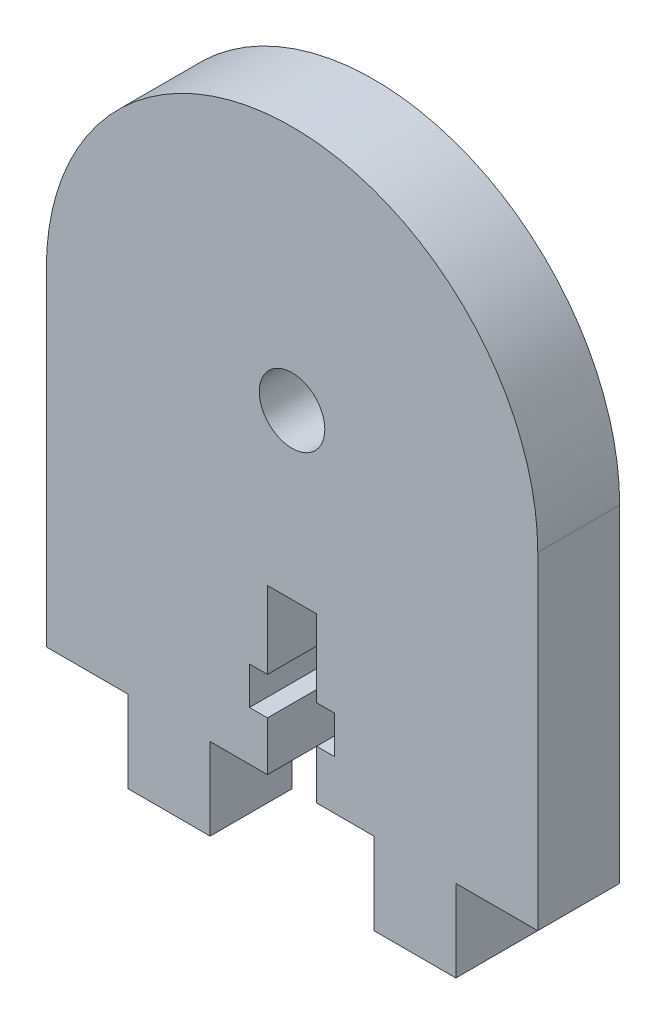
ISO-10303-21;
HEADER;
FILE_DESCRIPTION(('STEP AP214'),'2;1');
FILE_NAME('part.step','',(''),(''),'','','');
FILE_SCHEMA(('AUTOMOTIVE_DESIGN { 1 0 10303 214 1 1 1 1 }'));
ENDSEC;
DATA;
#1=APPLICATION_CONTEXT('core data for automotive mechanical design processes');
#2=APPLICATION_PROTOCOL_DEFINITION('international standard','automotive_design',2000,#1);
#3=PRODUCT_CONTEXT('',#1,'mechanical');
#4=PRODUCT('Part','Part','',(#3));
#5=PRODUCT_RELATED_PRODUCT_CATEGORY('part','',(#4));
#6=PRODUCT_DEFINITION_FORMATION('','',#4);
#7=PRODUCT_DEFINITION_CONTEXT('part definition',#1,'design');
#8=PRODUCT_DEFINITION('design','',#6,#7);
#9=PRODUCT_DEFINITION_SHAPE('','',#8);
#10=(LENGTH_UNIT() NAMED_UNIT(*) SI_UNIT(.MILLI.,.METRE.));
#11=(NAMED_UNIT(*) PLANE_ANGLE_UNIT() SI_UNIT($,.RADIAN.));
#12=(NAMED_UNIT(*) SI_UNIT($,.STERADIAN.) SOLID_ANGLE_UNIT());
#13=UNCERTAINTY_MEASURE_WITH_UNIT(LENGTH_MEASURE(1.E-05),#10,'distance_accuracy_value','');
#14=(GEOMETRIC_REPRESENTATION_CONTEXT(3) GLOBAL_UNCERTAINTY_ASSIGNED_CONTEXT((#13)) GLOBAL_UNIT_ASSIGNED_CONTEXT((#10,
#11,#12)) REPRESENTATION_CONTEXT('',''));
#15=CARTESIAN_POINT('',(0.,0.,0.));
#16=DIRECTION('',(0.,0.,1.));
#17=DIRECTION('',(1.,0.,0.));
#18=AXIS2_PLACEMENT_3D('',#15,#16,#17);
#19=CARTESIAN_POINT('',(0.,20.,5.));
#20=DIRECTION('',(0.,0.,-1.));
#21=DIRECTION('',(-1.,0.,0.));
#22=AXIS2_PLACEMENT_3D('',#19,#20,#21);
#23=PLANE('',#22);
#24=DIRECTION('',(0.,-1.,0.));
#25=VECTOR('',#24,1.);
#26=CARTESIAN_POINT('',(-10.,-5.,5.));
#27=LINE('',#26,#25);
#28=CARTESIAN_POINT('',(-10.,0.,5.));
#29=VERTEX_POINT('',#28);
#30=CARTESIAN_POINT('',(-10.,-5.,5.));
#31=VERTEX_POINT('',#30);
#32=EDGE_CURVE('E273',#29,#31,#27,.T.);
#33=ORIENTED_EDGE('',*,*,#32,.T.);
#34=DIRECTION('',(1.,0.,0.));
#35=VECTOR('',#34,1.);
#36=CARTESIAN_POINT('',(-5.,-5.,5.));
#37=LINE('',#36,#35);
#38=CARTESIAN_POINT('',(-5.,-5.,5.));
#39=VERTEX_POINT('',#38);
#40=EDGE_CURVE('E141',#31,#39,#37,.T.);
#41=ORIENTED_EDGE('',*,*,#40,.T.);
#42=DIRECTION('',(0.,1.,0.));
#43=VECTOR('',#42,1.);
#44=CARTESIAN_POINT('',(-5.,-5.,5.));
#45=LINE('',#44,#43);
#46=CARTESIAN_POINT('',(-5.,0.,5.));
#47=VERTEX_POINT('',#46);
#48=EDGE_CURVE('E336',#39,#47,#45,.T.);
#49=ORIENTED_EDGE('',*,*,#48,.T.);
#50=DIRECTION('',(1.,0.,0.));
#51=VECTOR('',#50,1.);
#52=CARTESIAN_POINT('',(-1.5,0.,5.));
#53=LINE('',#52,#51);
#54=CARTESIAN_POINT('',(-1.5,0.,5.));
#55=VERTEX_POINT('',#54);
#56=EDGE_CURVE('E355',#47,#55,#53,.T.);
#57=ORIENTED_EDGE('',*,*,#56,.T.);
#58=DIRECTION('',(0.,1.,0.));
#59=VECTOR('',#58,1.);
#60=CARTESIAN_POINT('',(-1.5,3.00000000000001,5.));
#61=LINE('',#60,#59);
#62=CARTESIAN_POINT('',(-1.5,3.00000000000001,5.));
#63=VERTEX_POINT('',#62);
#64=EDGE_CURVE('E352',#55,#63,#61,.T.);
#65=ORIENTED_EDGE('',*,*,#64,.T.);
#66=DIRECTION('',(-1.,0.,0.));
#67=VECTOR('',#66,1.);
#68=CARTESIAN_POINT('',(-1.5,3.00000000000001,5.));
#69=LINE('',#68,#67);
#70=CARTESIAN_POINT('',(-2.6,3.00000000000001,5.));
#71=VERTEX_POINT('',#70);
#72=EDGE_CURVE('E354',#63,#71,#69,.T.);
#73=ORIENTED_EDGE('',*,*,#72,.T.);
#74=DIRECTION('',(0.,1.,0.));
#75=VECTOR('',#74,1.);
#76=CARTESIAN_POINT('',(-2.6,3.00000000000001,5.));
#77=LINE('',#76,#75);
#78=CARTESIAN_POINT('',(-2.6,5.3,5.));
#79=VERTEX_POINT('',#78);
#80=EDGE_CURVE('E357',#71,#79,#77,.T.);
#81=ORIENTED_EDGE('',*,*,#80,.T.);
#82=DIRECTION('',(1.,0.,0.));
#83=VECTOR('',#82,1.);
#84=CARTESIAN_POINT('',(-2.6,5.3,5.));
#85=LINE('',#84,#83);
#86=CARTESIAN_POINT('',(-1.5,5.3,5.));
#87=VERTEX_POINT('',#86);
#88=EDGE_CURVE('E363',#79,#87,#85,.T.);
#89=ORIENTED_EDGE('',*,*,#88,.T.);
#90=DIRECTION('',(0.,1.,0.));
#91=VECTOR('',#90,1.);
#92=CARTESIAN_POINT('',(-1.5,10.,5.));
#93=LINE('',#92,#91);
#94=CARTESIAN_POINT('',(-1.5,10.,5.));
#95=VERTEX_POINT('',#94);
#96=EDGE_CURVE('E365',#87,#95,#93,.T.);
#97=ORIENTED_EDGE('',*,*,#96,.T.);
#98=DIRECTION('',(1.,0.,0.));
#99=VECTOR('',#98,1.);
#100=CARTESIAN_POINT('',(1.5,10.,5.));
#101=LINE('',#100,#99);
#102=CARTESIAN_POINT('',(1.5,10.,5.));
#103=VERTEX_POINT('',#102);
#104=EDGE_CURVE('E367',#95,#103,#101,.T.);
#105=ORIENTED_EDGE('',*,*,#104,.T.);
#106=DIRECTION('',(0.,-1.,0.));
#107=VECTOR('',#106,1.);
#108=CARTESIAN_POINT('',(1.5,5.3,5.));
#109=LINE('',#108,#107);
#110=CARTESIAN_POINT('',(1.5,5.3,5.));
#111=VERTEX_POINT('',#110);
#112=EDGE_CURVE('E369',#103,#111,#109,.T.);
#113=ORIENTED_EDGE('',*,*,#112,.T.);
#114=DIRECTION('',(1.,0.,0.));
#115=VECTOR('',#114,1.);
#116=CARTESIAN_POINT('',(1.5,5.3,5.));
#117=LINE('',#116,#115);
#118=CARTESIAN_POINT('',(2.6,5.3,5.));
#119=VERTEX_POINT('',#118);
#120=EDGE_CURVE('E371',#111,#119,#117,.T.);
#121=ORIENTED_EDGE('',*,*,#120,.T.);
#122=DIRECTION('',(0.,-1.,0.));
#123=VECTOR('',#122,1.);
#124=CARTESIAN_POINT('',(2.6,5.3,5.));
#125=LINE('',#124,#123);
#126=CARTESIAN_POINT('',(2.6,3.00000000000001,5.));
#127=VERTEX_POINT('',#126);
#128=EDGE_CURVE('E373',#119,#127,#125,.T.);
#129=ORIENTED_EDGE('',*,*,#128,.T.);
#130=DIRECTION('',(-1.,0.,0.));
#131=VECTOR('',#130,1.);
#132=CARTESIAN_POINT('',(2.6,3.00000000000001,5.));
#133=LINE('',#132,#131);
#134=CARTESIAN_POINT('',(1.5,3.00000000000001,5.));
#135=VERTEX_POINT('',#134);
#136=EDGE_CURVE('E375',#127,#135,#133,.T.);
#137=ORIENTED_EDGE('',*,*,#136,.T.);
#138=DIRECTION('',(0.,-1.,0.));
#139=VECTOR('',#138,1.);
#140=CARTESIAN_POINT('',(1.5,0.,5.));
#141=LINE('',#140,#139);
#142=CARTESIAN_POINT('',(1.5,0.,5.));
#143=VERTEX_POINT('',#142);
#144=EDGE_CURVE('E377',#135,#143,#141,.T.);
#145=ORIENTED_EDGE('',*,*,#144,.T.);
#146=DIRECTION('',(1.,0.,0.));
#147=VECTOR('',#146,1.);
#148=CARTESIAN_POINT('',(1.5,0.,5.));
#149=LINE('',#148,#147);
#150=CARTESIAN_POINT('',(5.,0.,5.));
#151=VERTEX_POINT('',#150);
#152=EDGE_CURVE('E379',#143,#151,#149,.T.);
#153=ORIENTED_EDGE('',*,*,#152,.T.);
#154=DIRECTION('',(0.,-1.,0.));
#155=VECTOR('',#154,1.);
#156=CARTESIAN_POINT('',(5.,0.,5.));
#157=LINE('',#156,#155);
#158=CARTESIAN_POINT('',(5.,-5.,5.));
#159=VERTEX_POINT('',#158);
#160=EDGE_CURVE('E381',#151,#159,#157,.T.);
#161=ORIENTED_EDGE('',*,*,#160,.T.);
#162=DIRECTION('',(1.,0.,0.));
#163=VECTOR('',#162,1.);
#164=CARTESIAN_POINT('',(5.,-5.,5.));
#165=LINE('',#164,#163);
#166=CARTESIAN_POINT('',(10.,-5.,5.));
#167=VERTEX_POINT('',#166);
#168=EDGE_CURVE('E383',#159,#167,#165,.T.);
#169=ORIENTED_EDGE('',*,*,#168,.T.);
#170=DIRECTION('',(0.,1.,0.));
#171=VECTOR('',#170,1.);
#172=CARTESIAN_POINT('',(10.,-5.,5.));
#173=LINE('',#172,#171);
#174=CARTESIAN_POINT('',(10.,0.,5.));
#175=VERTEX_POINT('',#174);
#176=EDGE_CURVE('E385',#167,#175,#173,.T.);
#177=ORIENTED_EDGE('',*,*,#176,.T.);
#178=DIRECTION('',(1.,0.,0.));
#179=VECTOR('',#178,1.);
#180=CARTESIAN_POINT('',(15.,0.,5.));
#181=LINE('',#180,#179);
#182=CARTESIAN_POINT('',(15.,0.,5.));
#183=VERTEX_POINT('',#182);
#184=EDGE_CURVE('E387',#175,#183,#181,.T.);
#185=ORIENTED_EDGE('',*,*,#184,.T.);
#186=DIRECTION('',(0.,1.,0.));
#187=VECTOR('',#186,1.);
#188=CARTESIAN_POINT('',(15.,20.,5.));
#189=LINE('',#188,#187);
#190=CARTESIAN_POINT('',(15.,20.,5.));
#191=VERTEX_POINT('',#190);
#192=EDGE_CURVE('E208',#183,#191,#189,.T.);
#193=ORIENTED_EDGE('',*,*,#192,.T.);
#194=CARTESIAN_POINT('',(0.,20.,5.));
#195=DIRECTION('',(0.,0.,1.));
#196=DIRECTION('',(-1.,0.,0.));
#197=AXIS2_PLACEMENT_3D('',#194,#195,#196);
#198=CIRCLE('',#197,15.);
#199=CARTESIAN_POINT('',(-15.,20.,5.));
#200=VERTEX_POINT('',#199);
#201=EDGE_CURVE('E202',#191,#200,#198,.T.);
#202=ORIENTED_EDGE('',*,*,#201,.T.);
#203=DIRECTION('',(0.,-1.,0.));
#204=VECTOR('',#203,1.);
#205=CARTESIAN_POINT('',(-15.,0.,5.));
#206=LINE('',#205,#204);
#207=CARTESIAN_POINT('',(-15.,0.,5.));
#208=VERTEX_POINT('',#207);
#209=EDGE_CURVE('E206',#200,#208,#206,.T.);
#210=ORIENTED_EDGE('',*,*,#209,.T.);
#211=DIRECTION('',(1.,0.,0.));
#212=VECTOR('',#211,1.);
#213=CARTESIAN_POINT('',(-10.,0.,5.));
#214=LINE('',#213,#212);
#215=EDGE_CURVE('E50',#208,#29,#214,.T.);
#216=ORIENTED_EDGE('',*,*,#215,.T.);
#217=EDGE_LOOP('',(#33,#41,#49,#57,#65,#73,#81,#89,#97,#105,#113,#121,#129,#137,#145,#153,#161,
#169,#177,#185,#193,#202,#210,#216));
#218=FACE_BOUND('',#217,.T.);
#219=CARTESIAN_POINT('',(0.,20.,5.));
#220=DIRECTION('',(0.,0.,1.));
#221=DIRECTION('',(1.,0.,0.));
#222=AXIS2_PLACEMENT_3D('',#219,#220,#221);
#223=CIRCLE('',#222,2.);
#224=CARTESIAN_POINT('',(2.,20.,5.));
#225=VERTEX_POINT('',#224);
#226=EDGE_CURVE('E230',#225,#225,#223,.T.);
#227=ORIENTED_EDGE('',*,*,#226,.F.);
#228=EDGE_LOOP('',(#227));
#229=FACE_BOUND('',#228,.T.);
#230=ADVANCED_FACE('F33',(#218,#229),#23,.F.);
#231=CARTESIAN_POINT('',(0.,20.,0.));
#232=DIRECTION('',(0.,0.,-1.));
#233=DIRECTION('',(-1.,0.,0.));
#234=AXIS2_PLACEMENT_3D('',#231,#232,#233);
#235=PLANE('',#234);
#236=DIRECTION('',(0.,-1.,0.));
#237=VECTOR('',#236,1.);
#238=CARTESIAN_POINT('',(-10.,-5.,0.));
#239=LINE('',#238,#237);
#240=CARTESIAN_POINT('',(-10.,0.,0.));
#241=VERTEX_POINT('',#240);
#242=CARTESIAN_POINT('',(-10.,-5.,0.));
#243=VERTEX_POINT('',#242);
#244=EDGE_CURVE('E226',#241,#243,#239,.T.);
#245=ORIENTED_EDGE('',*,*,#244,.F.);
#246=DIRECTION('',(1.,0.,0.));
#247=VECTOR('',#246,1.);
#248=CARTESIAN_POINT('',(-10.,0.,0.));
#249=LINE('',#248,#247);
#250=CARTESIAN_POINT('',(-15.,0.,0.));
#251=VERTEX_POINT('',#250);
#252=EDGE_CURVE('E133',#251,#241,#249,.T.);
#253=ORIENTED_EDGE('',*,*,#252,.F.);
#254=DIRECTION('',(0.,-1.,0.));
#255=VECTOR('',#254,1.);
#256=CARTESIAN_POINT('',(-15.,0.,0.));
#257=LINE('',#256,#255);
#258=CARTESIAN_POINT('',(-15.,20.,0.));
#259=VERTEX_POINT('',#258);
#260=EDGE_CURVE('E127',#259,#251,#257,.T.);
#261=ORIENTED_EDGE('',*,*,#260,.F.);
#262=CARTESIAN_POINT('',(0.,20.,0.));
#263=DIRECTION('',(0.,0.,1.));
#264=DIRECTION('',(-1.,0.,0.));
#265=AXIS2_PLACEMENT_3D('',#262,#263,#264);
#266=CIRCLE('',#265,15.);
#267=CARTESIAN_POINT('',(15.,20.,0.));
#268=VERTEX_POINT('',#267);
#269=EDGE_CURVE('E216',#268,#259,#266,.T.);
#270=ORIENTED_EDGE('',*,*,#269,.F.);
#271=DIRECTION('',(0.,1.,0.));
#272=VECTOR('',#271,1.);
#273=CARTESIAN_POINT('',(15.,20.,0.));
#274=LINE('',#273,#272);
#275=CARTESIAN_POINT('',(15.,0.,0.));
#276=VERTEX_POINT('',#275);
#277=EDGE_CURVE('E268',#276,#268,#274,.T.);
#278=ORIENTED_EDGE('',*,*,#277,.F.);
#279=DIRECTION('',(1.,0.,0.));
#280=VECTOR('',#279,1.);
#281=CARTESIAN_POINT('',(15.,0.,0.));
#282=LINE('',#281,#280);
#283=CARTESIAN_POINT('',(10.,0.,0.));
#284=VERTEX_POINT('',#283);
#285=EDGE_CURVE('E266',#284,#276,#282,.T.);
#286=ORIENTED_EDGE('',*,*,#285,.F.);
#287=DIRECTION('',(0.,1.,0.));
#288=VECTOR('',#287,1.);
#289=CARTESIAN_POINT('',(10.,-5.,0.));
#290=LINE('',#289,#288);
#291=CARTESIAN_POINT('',(10.,-5.,0.));
#292=VERTEX_POINT('',#291);
#293=EDGE_CURVE('E264',#292,#284,#290,.T.);
#294=ORIENTED_EDGE('',*,*,#293,.F.);
#295=DIRECTION('',(1.,0.,0.));
#296=VECTOR('',#295,1.);
#297=CARTESIAN_POINT('',(5.,-5.,0.));
#298=LINE('',#297,#296);
#299=CARTESIAN_POINT('',(5.,-5.,0.));
#300=VERTEX_POINT('',#299);
#301=EDGE_CURVE('E262',#300,#292,#298,.T.);
#302=ORIENTED_EDGE('',*,*,#301,.F.);
#303=DIRECTION('',(0.,-1.,0.));
#304=VECTOR('',#303,1.);
#305=CARTESIAN_POINT('',(5.,0.,0.));
#306=LINE('',#305,#304);
#307=CARTESIAN_POINT('',(5.,0.,0.));
#308=VERTEX_POINT('',#307);
#309=EDGE_CURVE('E260',#308,#300,#306,.T.);
#310=ORIENTED_EDGE('',*,*,#309,.F.);
#311=DIRECTION('',(1.,0.,0.));
#312=VECTOR('',#311,1.);
#313=CARTESIAN_POINT('',(1.5,0.,0.));
#314=LINE('',#313,#312);
#315=CARTESIAN_POINT('',(1.5,0.,0.));
#316=VERTEX_POINT('',#315);
#317=EDGE_CURVE('E258',#316,#308,#314,.T.);
#318=ORIENTED_EDGE('',*,*,#317,.F.);
#319=DIRECTION('',(0.,-1.,0.));
#320=VECTOR('',#319,1.);
#321=CARTESIAN_POINT('',(1.5,0.,0.));
#322=LINE('',#321,#320);
#323=CARTESIAN_POINT('',(1.5,3.00000000000001,0.));
#324=VERTEX_POINT('',#323);
#325=EDGE_CURVE('E256',#324,#316,#322,.T.);
#326=ORIENTED_EDGE('',*,*,#325,.F.);
#327=DIRECTION('',(-1.,0.,0.));
#328=VECTOR('',#327,1.);
#329=CARTESIAN_POINT('',(2.6,3.00000000000001,0.));
#330=LINE('',#329,#328);
#331=CARTESIAN_POINT('',(2.6,3.00000000000001,0.));
#332=VERTEX_POINT('',#331);
#333=EDGE_CURVE('E254',#332,#324,#330,.T.);
#334=ORIENTED_EDGE('',*,*,#333,.F.);
#335=DIRECTION('',(0.,-1.,0.));
#336=VECTOR('',#335,1.);
#337=CARTESIAN_POINT('',(2.6,5.3,0.));
#338=LINE('',#337,#336);
#339=CARTESIAN_POINT('',(2.6,5.3,0.));
#340=VERTEX_POINT('',#339);
#341=EDGE_CURVE('E252',#340,#332,#338,.T.);
#342=ORIENTED_EDGE('',*,*,#341,.F.);
#343=DIRECTION('',(1.,0.,0.));
#344=VECTOR('',#343,1.);
#345=CARTESIAN_POINT('',(1.5,5.3,0.));
#346=LINE('',#345,#344);
#347=CARTESIAN_POINT('',(1.5,5.3,0.));
#348=VERTEX_POINT('',#347);
#349=EDGE_CURVE('E250',#348,#340,#346,.T.);
#350=ORIENTED_EDGE('',*,*,#349,.F.);
#351=DIRECTION('',(0.,-1.,0.));
#352=VECTOR('',#351,1.);
#353=CARTESIAN_POINT('',(1.5,5.3,0.));
#354=LINE('',#353,#352);
#355=CARTESIAN_POINT('',(1.5,10.,0.));
#356=VERTEX_POINT('',#355);
#357=EDGE_CURVE('E248',#356,#348,#354,.T.);
#358=ORIENTED_EDGE('',*,*,#357,.F.);
#359=DIRECTION('',(1.,0.,0.));
#360=VECTOR('',#359,1.);
#361=CARTESIAN_POINT('',(1.5,10.,0.));
#362=LINE('',#361,#360);
#363=CARTESIAN_POINT('',(-1.5,10.,0.));
#364=VERTEX_POINT('',#363);
#365=EDGE_CURVE('E246',#364,#356,#362,.T.);
#366=ORIENTED_EDGE('',*,*,#365,.F.);
#367=DIRECTION('',(0.,1.,0.));
#368=VECTOR('',#367,1.);
#369=CARTESIAN_POINT('',(-1.5,10.,0.));
#370=LINE('',#369,#368);
#371=CARTESIAN_POINT('',(-1.5,5.3,0.));
#372=VERTEX_POINT('',#371);
#373=EDGE_CURVE('E244',#372,#364,#370,.T.);
#374=ORIENTED_EDGE('',*,*,#373,.F.);
#375=DIRECTION('',(1.,0.,0.));
#376=VECTOR('',#375,1.);
#377=CARTESIAN_POINT('',(-2.6,5.3,0.));
#378=LINE('',#377,#376);
#379=CARTESIAN_POINT('',(-2.6,5.3,0.));
#380=VERTEX_POINT('',#379);
#381=EDGE_CURVE('E242',#380,#372,#378,.T.);
#382=ORIENTED_EDGE('',*,*,#381,.F.);
#383=DIRECTION('',(0.,1.,0.));
#384=VECTOR('',#383,1.);
#385=CARTESIAN_POINT('',(-2.6,3.00000000000001,0.));
#386=LINE('',#385,#384);
#387=CARTESIAN_POINT('',(-2.6,3.00000000000001,0.));
#388=VERTEX_POINT('',#387);
#389=EDGE_CURVE('E240',#388,#380,#386,.T.);
#390=ORIENTED_EDGE('',*,*,#389,.F.);
#391=DIRECTION('',(-1.,0.,0.));
#392=VECTOR('',#391,1.);
#393=CARTESIAN_POINT('',(-1.5,3.00000000000001,0.));
#394=LINE('',#393,#392);
#395=CARTESIAN_POINT('',(-1.5,3.00000000000001,0.));
#396=VERTEX_POINT('',#395);
#397=EDGE_CURVE('E238',#396,#388,#394,.T.);
#398=ORIENTED_EDGE('',*,*,#397,.F.);
#399=DIRECTION('',(0.,1.,0.));
#400=VECTOR('',#399,1.);
#401=CARTESIAN_POINT('',(-1.5,3.00000000000001,0.));
#402=LINE('',#401,#400);
#403=CARTESIAN_POINT('',(-1.5,0.,0.));
#404=VERTEX_POINT('',#403);
#405=EDGE_CURVE('E236',#404,#396,#402,.T.);
#406=ORIENTED_EDGE('',*,*,#405,.F.);
#407=DIRECTION('',(1.,0.,0.));
#408=VECTOR('',#407,1.);
#409=CARTESIAN_POINT('',(-1.5,0.,0.));
#410=LINE('',#409,#408);
#411=CARTESIAN_POINT('',(-5.,0.,0.));
#412=VERTEX_POINT('',#411);
#413=EDGE_CURVE('E234',#412,#404,#410,.T.);
#414=ORIENTED_EDGE('',*,*,#413,.F.);
#415=DIRECTION('',(0.,1.,0.));
#416=VECTOR('',#415,1.);
#417=CARTESIAN_POINT('',(-5.,-5.,0.));
#418=LINE('',#417,#416);
#419=CARTESIAN_POINT('',(-5.,-5.,0.));
#420=VERTEX_POINT('',#419);
#421=EDGE_CURVE('E232',#420,#412,#418,.T.);
#422=ORIENTED_EDGE('',*,*,#421,.F.);
#423=DIRECTION('',(1.,0.,0.));
#424=VECTOR('',#423,1.);
#425=CARTESIAN_POINT('',(-5.,-5.,0.));
#426=LINE('',#425,#424);
#427=EDGE_CURVE('E229',#243,#420,#426,.T.);
#428=ORIENTED_EDGE('',*,*,#427,.F.);
#429=EDGE_LOOP('',(#245,#253,#261,#270,#278,#286,#294,#302,#310,#318,#326,#334,#342,#350,#358,
#366,#374,#382,#390,#398,#406,#414,#422,#428));
#430=FACE_BOUND('',#429,.T.);
#431=CARTESIAN_POINT('',(0.,20.,0.));
#432=DIRECTION('',(0.,0.,1.));
#433=DIRECTION('',(1.,0.,0.));
#434=AXIS2_PLACEMENT_3D('',#431,#432,#433);
#435=CIRCLE('',#434,2.);
#436=CARTESIAN_POINT('',(2.,20.,0.));
#437=VERTEX_POINT('',#436);
#438=EDGE_CURVE('E690',#437,#437,#435,.T.);
#439=ORIENTED_EDGE('',*,*,#438,.T.);
#440=EDGE_LOOP('',(#439));
#441=FACE_BOUND('',#440,.T.);
#442=ADVANCED_FACE('F340',(#430,#441),#235,.T.);
#443=CARTESIAN_POINT('',(-10.,-5.,5.));
#444=DIRECTION('',(1.,0.,0.));
#445=DIRECTION('',(0.,0.,-1.));
#446=AXIS2_PLACEMENT_3D('',#443,#444,#445);
#447=PLANE('',#446);
#448=ORIENTED_EDGE('',*,*,#244,.T.);
#449=DIRECTION('',(0.,0.,-1.));
#450=VECTOR('',#449,1.);
#451=CARTESIAN_POINT('',(-10.,-5.,5.));
#452=LINE('',#451,#450);
#453=EDGE_CURVE('E11',#31,#243,#452,.T.);
#454=ORIENTED_EDGE('',*,*,#453,.F.);
#455=ORIENTED_EDGE('',*,*,#32,.F.);
#456=DIRECTION('',(0.,0.,-1.));
#457=VECTOR('',#456,1.);
#458=CARTESIAN_POINT('',(-10.,0.,5.));
#459=LINE('',#458,#457);
#460=EDGE_CURVE('E222',#29,#241,#459,.T.);
#461=ORIENTED_EDGE('',*,*,#460,.T.);
#462=EDGE_LOOP('',(#448,#454,#455,#461));
#463=FACE_BOUND('',#462,.T.);
#464=ADVANCED_FACE('F35',(#463),#447,.F.);
#465=CARTESIAN_POINT('',(-5.,-5.,5.));
#466=DIRECTION('',(0.,1.,0.));
#467=DIRECTION('',(0.,0.,1.));
#468=AXIS2_PLACEMENT_3D('',#465,#466,#467);
#469=PLANE('',#468);
#470=ORIENTED_EDGE('',*,*,#427,.T.);
#471=DIRECTION('',(0.,0.,-1.));
#472=VECTOR('',#471,1.);
#473=CARTESIAN_POINT('',(-5.,-5.,5.));
#474=LINE('',#473,#472);
#475=EDGE_CURVE('E42',#39,#420,#474,.T.);
#476=ORIENTED_EDGE('',*,*,#475,.F.);
#477=ORIENTED_EDGE('',*,*,#40,.F.);
#478=ORIENTED_EDGE('',*,*,#453,.T.);
#479=EDGE_LOOP('',(#470,#476,#477,#478));
#480=FACE_BOUND('',#479,.T.);
#481=ADVANCED_FACE('F421',(#480),#469,.F.);
#482=CARTESIAN_POINT('',(-5.,-5.,5.));
#483=DIRECTION('',(-1.,0.,0.));
#484=DIRECTION('',(0.,-1.,0.));
#485=AXIS2_PLACEMENT_3D('',#482,#483,#484);
#486=PLANE('',#485);
#487=ORIENTED_EDGE('',*,*,#421,.T.);
#488=DIRECTION('',(0.,0.,-1.));
#489=VECTOR('',#488,1.);
#490=CARTESIAN_POINT('',(-5.,0.,5.));
#491=LINE('',#490,#489);
#492=EDGE_CURVE('E328',#47,#412,#491,.T.);
#493=ORIENTED_EDGE('',*,*,#492,.F.);
#494=ORIENTED_EDGE('',*,*,#48,.F.);
#495=ORIENTED_EDGE('',*,*,#475,.T.);
#496=EDGE_LOOP('',(#487,#493,#494,#495));
#497=FACE_BOUND('',#496,.T.);
#498=ADVANCED_FACE('F334',(#497),#486,.F.);
#499=CARTESIAN_POINT('',(-1.5,0.,5.));
#500=DIRECTION('',(0.,1.,0.));
#501=DIRECTION('',(-1.,0.,0.));
#502=AXIS2_PLACEMENT_3D('',#499,#500,#501);
#503=PLANE('',#502);
#504=ORIENTED_EDGE('',*,*,#413,.T.);
#505=DIRECTION('',(0.,0.,-1.));
#506=VECTOR('',#505,1.);
#507=CARTESIAN_POINT('',(-1.5,0.,5.));
#508=LINE('',#507,#506);
#509=EDGE_CURVE('E325',#55,#404,#508,.T.);
#510=ORIENTED_EDGE('',*,*,#509,.F.);
#511=ORIENTED_EDGE('',*,*,#56,.F.);
#512=ORIENTED_EDGE('',*,*,#492,.T.);
#513=EDGE_LOOP('',(#504,#510,#511,#512));
#514=FACE_BOUND('',#513,.T.);
#515=ADVANCED_FACE('F346',(#514),#503,.F.);
#516=CARTESIAN_POINT('',(-1.5,3.00000000000001,5.));
#517=DIRECTION('',(-1.,0.,0.));
#518=DIRECTION('',(0.,-1.,0.));
#519=AXIS2_PLACEMENT_3D('',#516,#517,#518);
#520=PLANE('',#519);
#521=ORIENTED_EDGE('',*,*,#405,.T.);
#522=DIRECTION('',(0.,0.,-1.));
#523=VECTOR('',#522,1.);
#524=CARTESIAN_POINT('',(-1.5,3.00000000000001,5.));
#525=LINE('',#524,#523);
#526=EDGE_CURVE('E322',#63,#396,#525,.T.);
#527=ORIENTED_EDGE('',*,*,#526,.F.);
#528=ORIENTED_EDGE('',*,*,#64,.F.);
#529=ORIENTED_EDGE('',*,*,#509,.T.);
#530=EDGE_LOOP('',(#521,#527,#528,#529));
#531=FACE_BOUND('',#530,.T.);
#532=ADVANCED_FACE('F350',(#531),#520,.F.);
#533=CARTESIAN_POINT('',(-1.5,3.00000000000001,5.));
#534=DIRECTION('',(0.,-1.,0.));
#535=DIRECTION('',(1.,0.,0.));
#536=AXIS2_PLACEMENT_3D('',#533,#534,#535);
#537=PLANE('',#536);
#538=ORIENTED_EDGE('',*,*,#397,.T.);
#539=DIRECTION('',(0.,0.,-1.));
#540=VECTOR('',#539,1.);
#541=CARTESIAN_POINT('',(-2.6,3.00000000000001,5.));
#542=LINE('',#541,#540);
#543=EDGE_CURVE('E319',#71,#388,#542,.T.);
#544=ORIENTED_EDGE('',*,*,#543,.F.);
#545=ORIENTED_EDGE('',*,*,#72,.F.);
#546=ORIENTED_EDGE('',*,*,#526,.T.);
#547=EDGE_LOOP('',(#538,#544,#545,#546));
#548=FACE_BOUND('',#547,.T.);
#549=ADVANCED_FACE('F434',(#548),#537,.F.);
#550=CARTESIAN_POINT('',(-2.6,3.00000000000001,5.));
#551=DIRECTION('',(-1.,0.,0.));
#552=DIRECTION('',(0.,-1.,0.));
#553=AXIS2_PLACEMENT_3D('',#550,#551,#552);
#554=PLANE('',#553);
#555=ORIENTED_EDGE('',*,*,#389,.T.);
#556=DIRECTION('',(0.,0.,-1.));
#557=VECTOR('',#556,1.);
#558=CARTESIAN_POINT('',(-2.6,5.3,5.));
#559=LINE('',#558,#557);
#560=EDGE_CURVE('E316',#79,#380,#559,.T.);
#561=ORIENTED_EDGE('',*,*,#560,.F.);
#562=ORIENTED_EDGE('',*,*,#80,.F.);
#563=ORIENTED_EDGE('',*,*,#543,.T.);
#564=EDGE_LOOP('',(#555,#561,#562,#563));
#565=FACE_BOUND('',#564,.T.);
#566=ADVANCED_FACE('F437',(#565),#554,.F.);
#567=CARTESIAN_POINT('',(-2.6,5.3,5.));
#568=DIRECTION('',(0.,1.,0.));
#569=DIRECTION('',(-1.,0.,0.));
#570=AXIS2_PLACEMENT_3D('',#567,#568,#569);
#571=PLANE('',#570);
#572=ORIENTED_EDGE('',*,*,#381,.T.);
#573=DIRECTION('',(0.,0.,-1.));
#574=VECTOR('',#573,1.);
#575=CARTESIAN_POINT('',(-1.5,5.3,5.));
#576=LINE('',#575,#574);
#577=EDGE_CURVE('E313',#87,#372,#576,.T.);
#578=ORIENTED_EDGE('',*,*,#577,.F.);
#579=ORIENTED_EDGE('',*,*,#88,.F.);
#580=ORIENTED_EDGE('',*,*,#560,.T.);
#581=EDGE_LOOP('',(#572,#578,#579,#580));
#582=FACE_BOUND('',#581,.T.);
#583=ADVANCED_FACE('F441',(#582),#571,.F.);
#584=CARTESIAN_POINT('',(-1.5,10.,5.));
#585=DIRECTION('',(-1.,0.,0.));
#586=DIRECTION('',(0.,-1.,0.));
#587=AXIS2_PLACEMENT_3D('',#584,#585,#586);
#588=PLANE('',#587);
#589=ORIENTED_EDGE('',*,*,#373,.T.);
#590=DIRECTION('',(0.,0.,-1.));
#591=VECTOR('',#590,1.);
#592=CARTESIAN_POINT('',(-1.5,10.,5.));
#593=LINE('',#592,#591);
#594=EDGE_CURVE('E310',#95,#364,#593,.T.);
#595=ORIENTED_EDGE('',*,*,#594,.F.);
#596=ORIENTED_EDGE('',*,*,#96,.F.);
#597=ORIENTED_EDGE('',*,*,#577,.T.);
#598=EDGE_LOOP('',(#589,#595,#596,#597));
#599=FACE_BOUND('',#598,.T.);
#600=ADVANCED_FACE('F445',(#599),#588,.F.);
#601=CARTESIAN_POINT('',(1.5,10.,5.));
#602=DIRECTION('',(0.,1.,0.));
#603=DIRECTION('',(0.,0.,1.));
#604=AXIS2_PLACEMENT_3D('',#601,#602,#603);
#605=PLANE('',#604);
#606=ORIENTED_EDGE('',*,*,#365,.T.);
#607=DIRECTION('',(0.,0.,-1.));
#608=VECTOR('',#607,1.);
#609=CARTESIAN_POINT('',(1.5,10.,5.));
#610=LINE('',#609,#608);
#611=EDGE_CURVE('E307',#103,#356,#610,.T.);
#612=ORIENTED_EDGE('',*,*,#611,.F.);
#613=ORIENTED_EDGE('',*,*,#104,.F.);
#614=ORIENTED_EDGE('',*,*,#594,.T.);
#615=EDGE_LOOP('',(#606,#612,#613,#614));
#616=FACE_BOUND('',#615,.T.);
#617=ADVANCED_FACE('F449',(#616),#605,.F.);
#618=CARTESIAN_POINT('',(1.5,5.3,5.));
#619=DIRECTION('',(1.,0.,0.));
#620=DIRECTION('',(0.,1.,0.));
#621=AXIS2_PLACEMENT_3D('',#618,#619,#620);
#622=PLANE('',#621);
#623=ORIENTED_EDGE('',*,*,#357,.T.);
#624=DIRECTION('',(0.,0.,-1.));
#625=VECTOR('',#624,1.);
#626=CARTESIAN_POINT('',(1.5,5.3,5.));
#627=LINE('',#626,#625);
#628=EDGE_CURVE('E304',#111,#348,#627,.T.);
#629=ORIENTED_EDGE('',*,*,#628,.F.);
#630=ORIENTED_EDGE('',*,*,#112,.F.);
#631=ORIENTED_EDGE('',*,*,#611,.T.);
#632=EDGE_LOOP('',(#623,#629,#630,#631));
#633=FACE_BOUND('',#632,.T.);
#634=ADVANCED_FACE('F453',(#633),#622,.F.);
#635=CARTESIAN_POINT('',(1.5,5.3,5.));
#636=DIRECTION('',(0.,1.,0.));
#637=DIRECTION('',(-1.,0.,0.));
#638=AXIS2_PLACEMENT_3D('',#635,#636,#637);
#639=PLANE('',#638);
#640=ORIENTED_EDGE('',*,*,#349,.T.);
#641=DIRECTION('',(0.,0.,-1.));
#642=VECTOR('',#641,1.);
#643=CARTESIAN_POINT('',(2.6,5.3,5.));
#644=LINE('',#643,#642);
#645=EDGE_CURVE('E301',#119,#340,#644,.T.);
#646=ORIENTED_EDGE('',*,*,#645,.F.);
#647=ORIENTED_EDGE('',*,*,#120,.F.);
#648=ORIENTED_EDGE('',*,*,#628,.T.);
#649=EDGE_LOOP('',(#640,#646,#647,#648));
#650=FACE_BOUND('',#649,.T.);
#651=ADVANCED_FACE('F457',(#650),#639,.F.);
#652=CARTESIAN_POINT('',(2.6,5.3,5.));
#653=DIRECTION('',(1.,0.,0.));
#654=DIRECTION('',(0.,1.,0.));
#655=AXIS2_PLACEMENT_3D('',#652,#653,#654);
#656=PLANE('',#655);
#657=ORIENTED_EDGE('',*,*,#341,.T.);
#658=DIRECTION('',(0.,0.,-1.));
#659=VECTOR('',#658,1.);
#660=CARTESIAN_POINT('',(2.6,3.00000000000001,5.));
#661=LINE('',#660,#659);
#662=EDGE_CURVE('E298',#127,#332,#661,.T.);
#663=ORIENTED_EDGE('',*,*,#662,.F.);
#664=ORIENTED_EDGE('',*,*,#128,.F.);
#665=ORIENTED_EDGE('',*,*,#645,.T.);
#666=EDGE_LOOP('',(#657,#663,#664,#665));
#667=FACE_BOUND('',#666,.T.);
#668=ADVANCED_FACE('F461',(#667),#656,.F.);
#669=CARTESIAN_POINT('',(2.6,3.00000000000001,5.));
#670=DIRECTION('',(0.,-1.,0.));
#671=DIRECTION('',(0.,0.,-1.));
#672=AXIS2_PLACEMENT_3D('',#669,#670,#671);
#673=PLANE('',#672);
#674=ORIENTED_EDGE('',*,*,#333,.T.);
#675=DIRECTION('',(0.,0.,-1.));
#676=VECTOR('',#675,1.);
#677=CARTESIAN_POINT('',(1.5,3.00000000000001,5.));
#678=LINE('',#677,#676);
#679=EDGE_CURVE('E295',#135,#324,#678,.T.);
#680=ORIENTED_EDGE('',*,*,#679,.F.);
#681=ORIENTED_EDGE('',*,*,#136,.F.);
#682=ORIENTED_EDGE('',*,*,#662,.T.);
#683=EDGE_LOOP('',(#674,#680,#681,#682));
#684=FACE_BOUND('',#683,.T.);
#685=ADVANCED_FACE('F465',(#684),#673,.F.);
#686=CARTESIAN_POINT('',(1.5,0.,5.));
#687=DIRECTION('',(1.,0.,0.));
#688=DIRECTION('',(0.,1.,0.));
#689=AXIS2_PLACEMENT_3D('',#686,#687,#688);
#690=PLANE('',#689);
#691=ORIENTED_EDGE('',*,*,#325,.T.);
#692=DIRECTION('',(0.,0.,-1.));
#693=VECTOR('',#692,1.);
#694=CARTESIAN_POINT('',(1.5,0.,5.));
#695=LINE('',#694,#693);
#696=EDGE_CURVE('E292',#143,#316,#695,.T.);
#697=ORIENTED_EDGE('',*,*,#696,.F.);
#698=ORIENTED_EDGE('',*,*,#144,.F.);
#699=ORIENTED_EDGE('',*,*,#679,.T.);
#700=EDGE_LOOP('',(#691,#697,#698,#699));
#701=FACE_BOUND('',#700,.T.);
#702=ADVANCED_FACE('F469',(#701),#690,.F.);
#703=CARTESIAN_POINT('',(1.5,0.,5.));
#704=DIRECTION('',(0.,1.,0.));
#705=DIRECTION('',(-1.,0.,0.));
#706=AXIS2_PLACEMENT_3D('',#703,#704,#705);
#707=PLANE('',#706);
#708=ORIENTED_EDGE('',*,*,#317,.T.);
#709=DIRECTION('',(0.,0.,-1.));
#710=VECTOR('',#709,1.);
#711=CARTESIAN_POINT('',(5.,0.,5.));
#712=LINE('',#711,#710);
#713=EDGE_CURVE('E289',#151,#308,#712,.T.);
#714=ORIENTED_EDGE('',*,*,#713,.F.);
#715=ORIENTED_EDGE('',*,*,#152,.F.);
#716=ORIENTED_EDGE('',*,*,#696,.T.);
#717=EDGE_LOOP('',(#708,#714,#715,#716));
#718=FACE_BOUND('',#717,.T.);
#719=ADVANCED_FACE('F473',(#718),#707,.F.);
#720=CARTESIAN_POINT('',(5.,0.,5.));
#721=DIRECTION('',(1.,0.,0.));
#722=DIRECTION('',(0.,1.,0.));
#723=AXIS2_PLACEMENT_3D('',#720,#721,#722);
#724=PLANE('',#723);
#725=ORIENTED_EDGE('',*,*,#309,.T.);
#726=DIRECTION('',(0.,0.,-1.));
#727=VECTOR('',#726,1.);
#728=CARTESIAN_POINT('',(5.,-5.,5.));
#729=LINE('',#728,#727);
#730=EDGE_CURVE('E286',#159,#300,#729,.T.);
#731=ORIENTED_EDGE('',*,*,#730,.F.);
#732=ORIENTED_EDGE('',*,*,#160,.F.);
#733=ORIENTED_EDGE('',*,*,#713,.T.);
#734=EDGE_LOOP('',(#725,#731,#732,#733));
#735=FACE_BOUND('',#734,.T.);
#736=ADVANCED_FACE('F477',(#735),#724,.F.);
#737=CARTESIAN_POINT('',(5.,-5.,5.));
#738=DIRECTION('',(0.,1.,0.));
#739=DIRECTION('',(0.,0.,1.));
#740=AXIS2_PLACEMENT_3D('',#737,#738,#739);
#741=PLANE('',#740);
#742=ORIENTED_EDGE('',*,*,#301,.T.);
#743=DIRECTION('',(0.,0.,-1.));
#744=VECTOR('',#743,1.);
#745=CARTESIAN_POINT('',(10.,-5.,5.));
#746=LINE('',#745,#744);
#747=EDGE_CURVE('E283',#167,#292,#746,.T.);
#748=ORIENTED_EDGE('',*,*,#747,.F.);
#749=ORIENTED_EDGE('',*,*,#168,.F.);
#750=ORIENTED_EDGE('',*,*,#730,.T.);
#751=EDGE_LOOP('',(#742,#748,#749,#750));
#752=FACE_BOUND('',#751,.T.);
#753=ADVANCED_FACE('F481',(#752),#741,.F.);
#754=CARTESIAN_POINT('',(10.,-5.,5.));
#755=DIRECTION('',(-1.,0.,0.));
#756=DIRECTION('',(0.,0.,1.));
#757=AXIS2_PLACEMENT_3D('',#754,#755,#756);
#758=PLANE('',#757);
#759=ORIENTED_EDGE('',*,*,#293,.T.);
#760=DIRECTION('',(0.,0.,-1.));
#761=VECTOR('',#760,1.);
#762=CARTESIAN_POINT('',(10.,0.,5.));
#763=LINE('',#762,#761);
#764=EDGE_CURVE('E280',#175,#284,#763,.T.);
#765=ORIENTED_EDGE('',*,*,#764,.F.);
#766=ORIENTED_EDGE('',*,*,#176,.F.);
#767=ORIENTED_EDGE('',*,*,#747,.T.);
#768=EDGE_LOOP('',(#759,#765,#766,#767));
#769=FACE_BOUND('',#768,.T.);
#770=ADVANCED_FACE('F485',(#769),#758,.F.);
#771=CARTESIAN_POINT('',(15.,0.,5.));
#772=DIRECTION('',(0.,1.,0.));
#773=DIRECTION('',(-1.,0.,0.));
#774=AXIS2_PLACEMENT_3D('',#771,#772,#773);
#775=PLANE('',#774);
#776=ORIENTED_EDGE('',*,*,#285,.T.);
#777=DIRECTION('',(0.,0.,-1.));
#778=VECTOR('',#777,1.);
#779=CARTESIAN_POINT('',(15.,0.,5.));
#780=LINE('',#779,#778);
#781=EDGE_CURVE('E277',#183,#276,#780,.T.);
#782=ORIENTED_EDGE('',*,*,#781,.F.);
#783=ORIENTED_EDGE('',*,*,#184,.F.);
#784=ORIENTED_EDGE('',*,*,#764,.T.);
#785=EDGE_LOOP('',(#776,#782,#783,#784));
#786=FACE_BOUND('',#785,.T.);
#787=ADVANCED_FACE('F393',(#786),#775,.F.);
#788=CARTESIAN_POINT('',(15.,20.,5.));
#789=DIRECTION('',(-1.,0.,0.));
#790=DIRECTION('',(0.,-1.,0.));
#791=AXIS2_PLACEMENT_3D('',#788,#789,#790);
#792=PLANE('',#791);
#793=ORIENTED_EDGE('',*,*,#277,.T.);
#794=DIRECTION('',(0.,0.,-1.));
#795=VECTOR('',#794,1.);
#796=CARTESIAN_POINT('',(15.,20.,5.));
#797=LINE('',#796,#795);
#798=EDGE_CURVE('E217',#191,#268,#797,.T.);
#799=ORIENTED_EDGE('',*,*,#798,.F.);
#800=ORIENTED_EDGE('',*,*,#192,.F.);
#801=ORIENTED_EDGE('',*,*,#781,.T.);
#802=EDGE_LOOP('',(#793,#799,#800,#801));
#803=FACE_BOUND('',#802,.T.);
#804=ADVANCED_FACE('F397',(#803),#792,.F.);
#805=CARTESIAN_POINT('',(0.,20.,5.));
#806=DIRECTION('',(0.,0.,-1.));
#807=DIRECTION('',(-1.,0.,0.));
#808=AXIS2_PLACEMENT_3D('',#805,#806,#807);
#809=CYLINDRICAL_SURFACE('',#808,15.);
#810=ORIENTED_EDGE('',*,*,#269,.T.);
#811=DIRECTION('',(0.,0.,-1.));
#812=VECTOR('',#811,1.);
#813=CARTESIAN_POINT('',(-15.,20.,5.));
#814=LINE('',#813,#812);
#815=EDGE_CURVE('E213',#200,#259,#814,.T.);
#816=ORIENTED_EDGE('',*,*,#815,.F.);
#817=ORIENTED_EDGE('',*,*,#201,.F.);
#818=ORIENTED_EDGE('',*,*,#798,.T.);
#819=EDGE_LOOP('',(#810,#816,#817,#818));
#820=FACE_BOUND('',#819,.T.);
#821=ADVANCED_FACE('F214',(#820),#809,.T.);
#822=CARTESIAN_POINT('',(-15.,0.,5.));
#823=DIRECTION('',(1.,0.,0.));
#824=DIRECTION('',(0.,0.,-1.));
#825=AXIS2_PLACEMENT_3D('',#822,#823,#824);
#826=PLANE('',#825);
#827=ORIENTED_EDGE('',*,*,#260,.T.);
#828=DIRECTION('',(0.,0.,-1.));
#829=VECTOR('',#828,1.);
#830=CARTESIAN_POINT('',(-15.,0.,5.));
#831=LINE('',#830,#829);
#832=EDGE_CURVE('E218',#208,#251,#831,.T.);
#833=ORIENTED_EDGE('',*,*,#832,.F.);
#834=ORIENTED_EDGE('',*,*,#209,.F.);
#835=ORIENTED_EDGE('',*,*,#815,.T.);
#836=EDGE_LOOP('',(#827,#833,#834,#835));
#837=FACE_BOUND('',#836,.T.);
#838=ADVANCED_FACE('F220',(#837),#826,.F.);
#839=CARTESIAN_POINT('',(-10.,0.,5.));
#840=DIRECTION('',(0.,1.,0.));
#841=DIRECTION('',(-1.,0.,0.));
#842=AXIS2_PLACEMENT_3D('',#839,#840,#841);
#843=PLANE('',#842);
#844=ORIENTED_EDGE('',*,*,#252,.T.);
#845=ORIENTED_EDGE('',*,*,#460,.F.);
#846=ORIENTED_EDGE('',*,*,#215,.F.);
#847=ORIENTED_EDGE('',*,*,#832,.T.);
#848=EDGE_LOOP('',(#844,#845,#846,#847));
#849=FACE_BOUND('',#848,.T.);
#850=ADVANCED_FACE('F401',(#849),#843,.F.);
#851=CARTESIAN_POINT('',(0.,20.,5.));
#852=DIRECTION('',(0.,0.,-1.));
#853=DIRECTION('',(-1.,0.,0.));
#854=AXIS2_PLACEMENT_3D('',#851,#852,#853);
#855=CYLINDRICAL_SURFACE('',#854,2.);
#856=ORIENTED_EDGE('',*,*,#226,.T.);
#857=EDGE_LOOP('',(#856));
#858=FACE_BOUND('',#857,.T.);
#859=ORIENTED_EDGE('',*,*,#438,.F.);
#860=EDGE_LOOP('',(#859));
#861=FACE_BOUND('',#860,.T.);
#862=ADVANCED_FACE('F403',(#858,#861),#855,.F.);
#863=CLOSED_SHELL('',(#230,#442,#464,#481,#498,#515,#532,#549,#566,#583,#600,#617,#634,#651,
#668,#685,#702,#719,#736,#753,#770,#787,#804,#821,#838,#850,#862));
#864=MANIFOLD_SOLID_BREP('B2',#863);
#865=ADVANCED_BREP_SHAPE_REPRESENTATION('',(#18,#864),#14);
#866=SHAPE_DEFINITION_REPRESENTATION(#9,#865);
ENDSEC;
END-ISO-10303-21;
